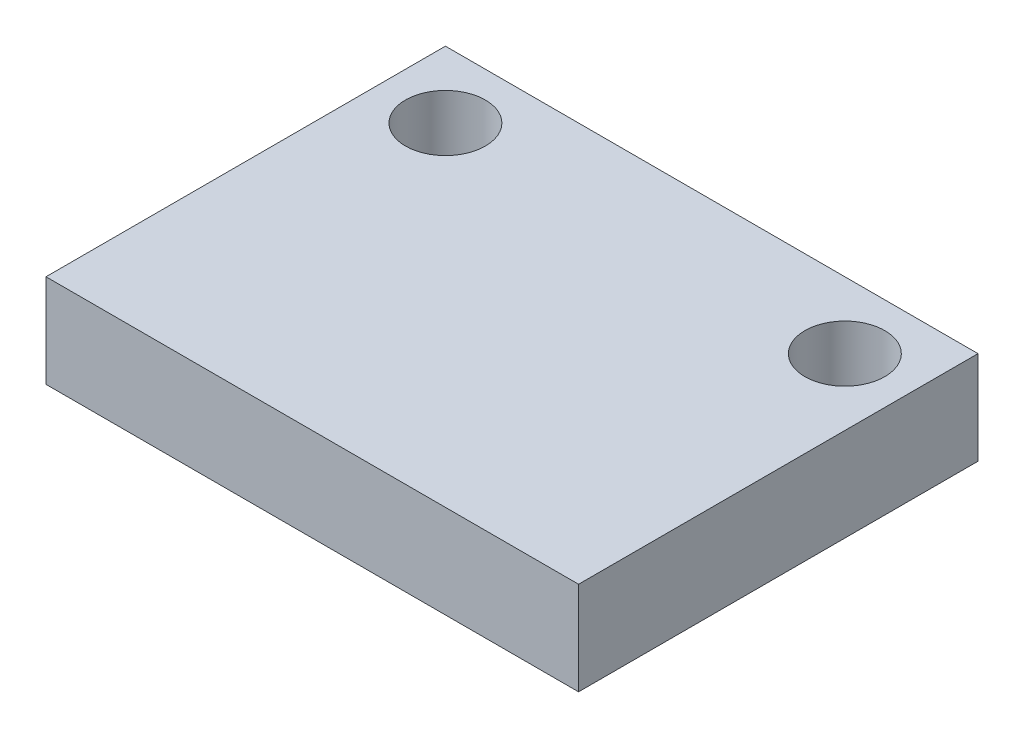
ISO-10303-21;
HEADER;
FILE_DESCRIPTION(('STEP AP214'),'2;1');
FILE_NAME('part.step','',(''),(''),'','','');
FILE_SCHEMA(('AUTOMOTIVE_DESIGN { 1 0 10303 214 1 1 1 1 }'));
ENDSEC;
DATA;
#1=APPLICATION_CONTEXT('core data for automotive mechanical design processes');
#2=APPLICATION_PROTOCOL_DEFINITION('international standard','automotive_design',2000,#1);
#3=PRODUCT_CONTEXT('',#1,'mechanical');
#4=PRODUCT('Part','Part','',(#3));
#5=PRODUCT_RELATED_PRODUCT_CATEGORY('part','',(#4));
#6=PRODUCT_DEFINITION_FORMATION('','',#4);
#7=PRODUCT_DEFINITION_CONTEXT('part definition',#1,'design');
#8=PRODUCT_DEFINITION('design','',#6,#7);
#9=PRODUCT_DEFINITION_SHAPE('','',#8);
#10=(LENGTH_UNIT() NAMED_UNIT(*) SI_UNIT(.MILLI.,.METRE.));
#11=(NAMED_UNIT(*) PLANE_ANGLE_UNIT() SI_UNIT($,.RADIAN.));
#12=(NAMED_UNIT(*) SI_UNIT($,.STERADIAN.) SOLID_ANGLE_UNIT());
#13=UNCERTAINTY_MEASURE_WITH_UNIT(LENGTH_MEASURE(1.E-05),#10,'distance_accuracy_value','');
#14=(GEOMETRIC_REPRESENTATION_CONTEXT(3) GLOBAL_UNCERTAINTY_ASSIGNED_CONTEXT((#13)) GLOBAL_UNIT_ASSIGNED_CONTEXT((#10,
#11,#12)) REPRESENTATION_CONTEXT('',''));
#15=CARTESIAN_POINT('',(0.,0.,0.));
#16=DIRECTION('',(0.,0.,1.));
#17=DIRECTION('',(1.,0.,0.));
#18=AXIS2_PLACEMENT_3D('',#15,#16,#17);
#19=CARTESIAN_POINT('',(0.,3.5,-15.));
#20=DIRECTION('',(0.,0.,-1.));
#21=DIRECTION('',(-1.,0.,0.));
#22=AXIS2_PLACEMENT_3D('',#19,#20,#21);
#23=PLANE('',#22);
#24=DIRECTION('',(1.,0.,0.));
#25=VECTOR('',#24,1.);
#26=CARTESIAN_POINT('',(0.,0.,-15.));
#27=LINE('',#26,#25);
#28=CARTESIAN_POINT('',(0.,0.,-15.));
#29=VERTEX_POINT('',#28);
#30=CARTESIAN_POINT('',(20.,0.,-15.));
#31=VERTEX_POINT('',#30);
#32=EDGE_CURVE('E113',#29,#31,#27,.T.);
#33=ORIENTED_EDGE('',*,*,#32,.F.);
#34=DIRECTION('',(0.,-1.,0.));
#35=VECTOR('',#34,1.);
#36=CARTESIAN_POINT('',(0.,3.5,-15.));
#37=LINE('',#36,#35);
#38=CARTESIAN_POINT('',(0.,3.5,-15.));
#39=VERTEX_POINT('',#38);
#40=EDGE_CURVE('E11',#39,#29,#37,.T.);
#41=ORIENTED_EDGE('',*,*,#40,.F.);
#42=DIRECTION('',(1.,0.,0.));
#43=VECTOR('',#42,1.);
#44=CARTESIAN_POINT('',(0.,3.5,-15.));
#45=LINE('',#44,#43);
#46=CARTESIAN_POINT('',(20.,3.5,-15.));
#47=VERTEX_POINT('',#46);
#48=EDGE_CURVE('E101',#39,#47,#45,.T.);
#49=ORIENTED_EDGE('',*,*,#48,.T.);
#50=DIRECTION('',(0.,-1.,0.));
#51=VECTOR('',#50,1.);
#52=CARTESIAN_POINT('',(20.,3.5,-15.));
#53=LINE('',#52,#51);
#54=EDGE_CURVE('E81',#47,#31,#53,.T.);
#55=ORIENTED_EDGE('',*,*,#54,.T.);
#56=EDGE_LOOP('',(#33,#41,#49,#55));
#57=FACE_BOUND('',#56,.T.);
#58=ADVANCED_FACE('F43',(#57),#23,.T.);
#59=CARTESIAN_POINT('',(0.,3.5,0.));
#60=DIRECTION('',(-1.,0.,0.));
#61=DIRECTION('',(0.,0.,1.));
#62=AXIS2_PLACEMENT_3D('',#59,#60,#61);
#63=PLANE('',#62);
#64=DIRECTION('',(0.,0.,-1.));
#65=VECTOR('',#64,1.);
#66=CARTESIAN_POINT('',(0.,0.,0.));
#67=LINE('',#66,#65);
#68=CARTESIAN_POINT('',(0.,0.,0.));
#69=VERTEX_POINT('',#68);
#70=EDGE_CURVE('E94',#69,#29,#67,.T.);
#71=ORIENTED_EDGE('',*,*,#70,.F.);
#72=DIRECTION('',(0.,-1.,0.));
#73=VECTOR('',#72,1.);
#74=CARTESIAN_POINT('',(0.,3.5,0.));
#75=LINE('',#74,#73);
#76=CARTESIAN_POINT('',(0.,3.5,0.));
#77=VERTEX_POINT('',#76);
#78=EDGE_CURVE('E51',#77,#69,#75,.T.);
#79=ORIENTED_EDGE('',*,*,#78,.F.);
#80=DIRECTION('',(0.,0.,-1.));
#81=VECTOR('',#80,1.);
#82=CARTESIAN_POINT('',(0.,3.5,0.));
#83=LINE('',#82,#81);
#84=EDGE_CURVE('E92',#77,#39,#83,.T.);
#85=ORIENTED_EDGE('',*,*,#84,.T.);
#86=ORIENTED_EDGE('',*,*,#40,.T.);
#87=EDGE_LOOP('',(#71,#79,#85,#86));
#88=FACE_BOUND('',#87,.T.);
#89=ADVANCED_FACE('F90',(#88),#63,.T.);
#90=CARTESIAN_POINT('',(0.,3.5,0.));
#91=DIRECTION('',(0.,0.,-1.));
#92=DIRECTION('',(-1.,0.,0.));
#93=AXIS2_PLACEMENT_3D('',#90,#91,#92);
#94=PLANE('',#93);
#95=DIRECTION('',(1.,0.,0.));
#96=VECTOR('',#95,1.);
#97=CARTESIAN_POINT('',(0.,0.,0.));
#98=LINE('',#97,#96);
#99=CARTESIAN_POINT('',(20.,0.,0.));
#100=VERTEX_POINT('',#99);
#101=EDGE_CURVE('E74',#69,#100,#98,.T.);
#102=ORIENTED_EDGE('',*,*,#101,.T.);
#103=DIRECTION('',(0.,-1.,0.));
#104=VECTOR('',#103,1.);
#105=CARTESIAN_POINT('',(20.,3.5,0.));
#106=LINE('',#105,#104);
#107=CARTESIAN_POINT('',(20.,3.5,0.));
#108=VERTEX_POINT('',#107);
#109=EDGE_CURVE('E95',#108,#100,#106,.T.);
#110=ORIENTED_EDGE('',*,*,#109,.F.);
#111=DIRECTION('',(1.,0.,0.));
#112=VECTOR('',#111,1.);
#113=CARTESIAN_POINT('',(0.,3.5,0.));
#114=LINE('',#113,#112);
#115=EDGE_CURVE('E96',#77,#108,#114,.T.);
#116=ORIENTED_EDGE('',*,*,#115,.F.);
#117=ORIENTED_EDGE('',*,*,#78,.T.);
#118=EDGE_LOOP('',(#102,#110,#116,#117));
#119=FACE_BOUND('',#118,.T.);
#120=ADVANCED_FACE('F97',(#119),#94,.F.);
#121=CARTESIAN_POINT('',(17.5,3.5,-12.5));
#122=DIRECTION('',(0.,-1.,0.));
#123=DIRECTION('',(0.,0.,-1.));
#124=AXIS2_PLACEMENT_3D('',#121,#122,#123);
#125=CYLINDRICAL_SURFACE('',#124,1.5);
#126=CARTESIAN_POINT('',(17.5,3.5,-12.5));
#127=DIRECTION('',(0.,1.,0.));
#128=DIRECTION('',(0.,0.,1.));
#129=AXIS2_PLACEMENT_3D('',#126,#127,#128);
#130=CIRCLE('',#129,1.5);
#131=CARTESIAN_POINT('',(17.5,3.5,-11.));
#132=VERTEX_POINT('',#131);
#133=EDGE_CURVE('E107',#132,#132,#130,.F.);
#134=ORIENTED_EDGE('',*,*,#133,.F.);
#135=EDGE_LOOP('',(#134));
#136=FACE_BOUND('',#135,.T.);
#137=CARTESIAN_POINT('',(17.5,0.,-12.5));
#138=DIRECTION('',(0.,1.,0.));
#139=DIRECTION('',(0.,0.,1.));
#140=AXIS2_PLACEMENT_3D('',#137,#138,#139);
#141=CIRCLE('',#140,1.5);
#142=CARTESIAN_POINT('',(17.5,0.,-11.));
#143=VERTEX_POINT('',#142);
#144=EDGE_CURVE('E120',#143,#143,#141,.F.);
#145=ORIENTED_EDGE('',*,*,#144,.T.);
#146=EDGE_LOOP('',(#145));
#147=FACE_BOUND('',#146,.T.);
#148=ADVANCED_FACE('F139',(#136,#147),#125,.F.);
#149=CARTESIAN_POINT('',(20.,3.5,0.));
#150=DIRECTION('',(-1.,0.,0.));
#151=DIRECTION('',(0.,0.,1.));
#152=AXIS2_PLACEMENT_3D('',#149,#150,#151);
#153=PLANE('',#152);
#154=DIRECTION('',(0.,0.,-1.));
#155=VECTOR('',#154,1.);
#156=CARTESIAN_POINT('',(20.,0.,0.));
#157=LINE('',#156,#155);
#158=EDGE_CURVE('E118',#100,#31,#157,.T.);
#159=ORIENTED_EDGE('',*,*,#158,.T.);
#160=ORIENTED_EDGE('',*,*,#54,.F.);
#161=DIRECTION('',(0.,0.,-1.));
#162=VECTOR('',#161,1.);
#163=CARTESIAN_POINT('',(20.,3.5,0.));
#164=LINE('',#163,#162);
#165=EDGE_CURVE('E59',#108,#47,#164,.T.);
#166=ORIENTED_EDGE('',*,*,#165,.F.);
#167=ORIENTED_EDGE('',*,*,#109,.T.);
#168=EDGE_LOOP('',(#159,#160,#166,#167));
#169=FACE_BOUND('',#168,.T.);
#170=ADVANCED_FACE('F128',(#169),#153,.F.);
#171=CARTESIAN_POINT('',(2.5,3.5,-12.5));
#172=DIRECTION('',(0.,-1.,0.));
#173=DIRECTION('',(0.,0.,-1.));
#174=AXIS2_PLACEMENT_3D('',#171,#172,#173);
#175=CYLINDRICAL_SURFACE('',#174,1.5);
#176=CARTESIAN_POINT('',(2.5,3.5,-12.5));
#177=DIRECTION('',(0.,1.,0.));
#178=DIRECTION('',(0.,0.,1.));
#179=AXIS2_PLACEMENT_3D('',#176,#177,#178);
#180=CIRCLE('',#179,1.5);
#181=CARTESIAN_POINT('',(2.5,3.5,-11.));
#182=VERTEX_POINT('',#181);
#183=EDGE_CURVE('E110',#182,#182,#180,.T.);
#184=ORIENTED_EDGE('',*,*,#183,.T.);
#185=EDGE_LOOP('',(#184));
#186=FACE_BOUND('',#185,.T.);
#187=CARTESIAN_POINT('',(2.5,0.,-12.5));
#188=DIRECTION('',(0.,1.,0.));
#189=DIRECTION('',(0.,0.,1.));
#190=AXIS2_PLACEMENT_3D('',#187,#188,#189);
#191=CIRCLE('',#190,1.5);
#192=CARTESIAN_POINT('',(2.5,0.,-11.));
#193=VERTEX_POINT('',#192);
#194=EDGE_CURVE('E103',#193,#193,#191,.T.);
#195=ORIENTED_EDGE('',*,*,#194,.F.);
#196=EDGE_LOOP('',(#195));
#197=FACE_BOUND('',#196,.T.);
#198=ADVANCED_FACE('F144',(#186,#197),#175,.F.);
#199=CARTESIAN_POINT('',(0.,3.5,0.));
#200=DIRECTION('',(0.,1.,0.));
#201=DIRECTION('',(0.,0.,1.));
#202=AXIS2_PLACEMENT_3D('',#199,#200,#201);
#203=PLANE('',#202);
#204=ORIENTED_EDGE('',*,*,#48,.F.);
#205=ORIENTED_EDGE('',*,*,#84,.F.);
#206=ORIENTED_EDGE('',*,*,#115,.T.);
#207=ORIENTED_EDGE('',*,*,#165,.T.);
#208=EDGE_LOOP('',(#204,#205,#206,#207));
#209=FACE_BOUND('',#208,.T.);
#210=ORIENTED_EDGE('',*,*,#133,.T.);
#211=EDGE_LOOP('',(#210));
#212=FACE_BOUND('',#211,.T.);
#213=ORIENTED_EDGE('',*,*,#183,.F.);
#214=EDGE_LOOP('',(#213));
#215=FACE_BOUND('',#214,.T.);
#216=ADVANCED_FACE('F99',(#209,#212,#215),#203,.T.);
#217=CARTESIAN_POINT('',(0.,0.,0.));
#218=DIRECTION('',(0.,1.,0.));
#219=DIRECTION('',(0.,0.,1.));
#220=AXIS2_PLACEMENT_3D('',#217,#218,#219);
#221=PLANE('',#220);
#222=ORIENTED_EDGE('',*,*,#32,.T.);
#223=ORIENTED_EDGE('',*,*,#158,.F.);
#224=ORIENTED_EDGE('',*,*,#101,.F.);
#225=ORIENTED_EDGE('',*,*,#70,.T.);
#226=EDGE_LOOP('',(#222,#223,#224,#225));
#227=FACE_BOUND('',#226,.T.);
#228=ORIENTED_EDGE('',*,*,#144,.F.);
#229=EDGE_LOOP('',(#228));
#230=FACE_BOUND('',#229,.T.);
#231=ORIENTED_EDGE('',*,*,#194,.T.);
#232=EDGE_LOOP('',(#231));
#233=FACE_BOUND('',#232,.T.);
#234=ADVANCED_FACE('F130',(#227,#230,#233),#221,.F.);
#235=CLOSED_SHELL('',(#58,#89,#120,#148,#170,#198,#216,#234));
#236=MANIFOLD_SOLID_BREP('B2',#235);
#237=ADVANCED_BREP_SHAPE_REPRESENTATION('',(#18,#236),#14);
#238=SHAPE_DEFINITION_REPRESENTATION(#9,#237);
ENDSEC;
END-ISO-10303-21;
